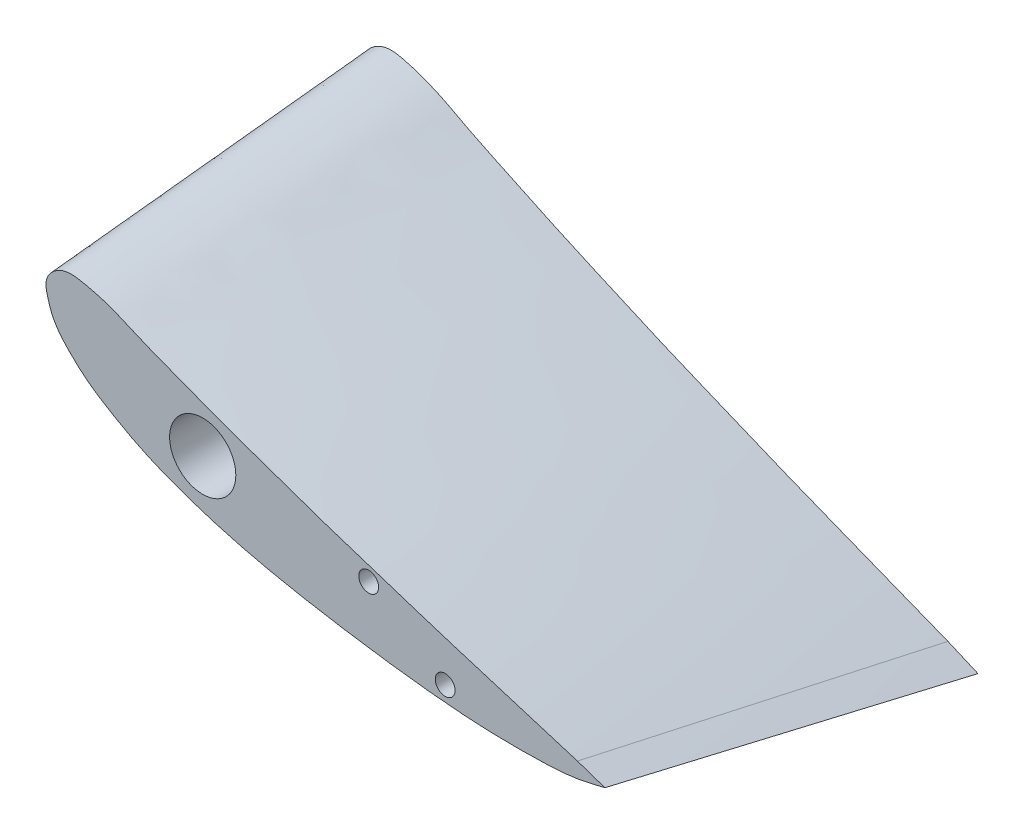
ISO-10303-21;
HEADER;
FILE_DESCRIPTION(('STEP AP214'),'2;1');
FILE_NAME('part.step','',(''),(''),'','','');
FILE_SCHEMA(('AUTOMOTIVE_DESIGN { 1 0 10303 214 1 1 1 1 }'));
ENDSEC;
DATA;
#1=APPLICATION_CONTEXT('core data for automotive mechanical design processes');
#2=APPLICATION_PROTOCOL_DEFINITION('international standard','automotive_design',2000,#1);
#3=PRODUCT_CONTEXT('',#1,'mechanical');
#4=PRODUCT('Part','Part','',(#3));
#5=PRODUCT_RELATED_PRODUCT_CATEGORY('part','',(#4));
#6=PRODUCT_DEFINITION_FORMATION('','',#4);
#7=PRODUCT_DEFINITION_CONTEXT('part definition',#1,'design');
#8=PRODUCT_DEFINITION('design','',#6,#7);
#9=PRODUCT_DEFINITION_SHAPE('','',#8);
#10=(LENGTH_UNIT() NAMED_UNIT(*) SI_UNIT(.MILLI.,.METRE.));
#11=(NAMED_UNIT(*) PLANE_ANGLE_UNIT() SI_UNIT($,.RADIAN.));
#12=(NAMED_UNIT(*) SI_UNIT($,.STERADIAN.) SOLID_ANGLE_UNIT());
#13=UNCERTAINTY_MEASURE_WITH_UNIT(LENGTH_MEASURE(1.E-05),#10,'distance_accuracy_value','');
#14=(GEOMETRIC_REPRESENTATION_CONTEXT(3) GLOBAL_UNCERTAINTY_ASSIGNED_CONTEXT((#13)) GLOBAL_UNIT_ASSIGNED_CONTEXT((#10,
#11,#12)) REPRESENTATION_CONTEXT('',''));
#15=CARTESIAN_POINT('',(0.,0.,0.));
#16=DIRECTION('',(0.,0.,1.));
#17=DIRECTION('',(1.,0.,0.));
#18=AXIS2_PLACEMENT_3D('',#15,#16,#17);
#19=CARTESIAN_POINT('',(-25.0498265206238,10.3590252410629,-50.));
#20=DIRECTION('',(0.,0.,1.));
#21=DIRECTION('',(1.,0.,0.));
#22=AXIS2_PLACEMENT_3D('',#19,#20,#21);
#23=PLANE('',#22);
#24=CARTESIAN_POINT('',(36.622171624693,-11.6170764544321,-50.));
#25=DIRECTION('',(0.,0.,1.));
#26=DIRECTION('',(1.,0.,0.));
#27=AXIS2_PLACEMENT_3D('',#24,#25,#26);
#28=CIRCLE('',#27,1.5);
#29=CARTESIAN_POINT('',(38.122171624693,-11.6170764544321,-50.));
#30=VERTEX_POINT('',#29);
#31=EDGE_CURVE('E86',#30,#30,#28,.T.);
#32=ORIENTED_EDGE('',*,*,#31,.T.);
#33=EDGE_LOOP('',(#32));
#34=FACE_BOUND('',#33,.T.);
#35=CARTESIAN_POINT('',(0.,0.,-50.));
#36=DIRECTION('',(0.,0.,1.));
#37=DIRECTION('',(1.,0.,0.));
#38=AXIS2_PLACEMENT_3D('',#35,#36,#37);
#39=CIRCLE('',#38,5.);
#40=CARTESIAN_POINT('',(5.,0.,-50.));
#41=VERTEX_POINT('',#40);
#42=EDGE_CURVE('E66',#41,#41,#39,.T.);
#43=ORIENTED_EDGE('',*,*,#42,.T.);
#44=EDGE_LOOP('',(#43));
#45=FACE_BOUND('',#44,.T.);
#46=CARTESIAN_POINT('',(62.5682376225377,-17.9494229542019,-50.));
#47=CARTESIAN_POINT('',(61.0357457282401,-17.3455695900279,-50.));
#48=CARTESIAN_POINT('',(56.4382700453486,-15.5340094975074,-50.));
#49=CARTESIAN_POINT('',(48.781755680583,-12.5000503526215,-50.));
#50=CARTESIAN_POINT('',(39.5664322748496,-8.93022166843071,-50.));
#51=CARTESIAN_POINT('',(30.4567321540915,-5.10230838615116,-50.));
#52=CARTESIAN_POINT('',(21.2890860327248,-1.41760363622451,-50.));
#53=CARTESIAN_POINT('',(12.2537365587949,2.57937965401302,-50.));
#54=CARTESIAN_POINT('',(3.21095936745961,6.5641300105625,-50.));
#55=CARTESIAN_POINT('',(-4.21736498331717,10.1219086891791,-50.));
#56=CARTESIAN_POINT('',(-10.1774723136762,12.9464593951471,-50.));
#57=CARTESIAN_POINT('',(-13.7648359699021,14.9884174682574,-50.));
#58=CARTESIAN_POINT('',(-16.8358573857455,16.2288422339769,-50.));
#59=CARTESIAN_POINT('',(-19.2080375673609,16.9777128391934,-50.));
#60=CARTESIAN_POINT('',(-21.3952292871398,17.4877016099179,-50.));
#61=CARTESIAN_POINT('',(-23.771560650514,16.9689972608538,-50.));
#62=CARTESIAN_POINT('',(-26.0433252267511,15.0075642123905,-50.));
#63=CARTESIAN_POINT('',(-25.5032404090968,12.1047307293946,-50.));
#64=CARTESIAN_POINT('',(-24.8803183236597,9.51973752205132,-50.));
#65=CARTESIAN_POINT('',(-23.5261895675087,7.21966070796016,-50.));
#66=CARTESIAN_POINT('',(-21.6743094600578,5.04276467310707,-50.));
#67=CARTESIAN_POINT('',(-19.2500879985792,2.47005140726315,-50.));
#68=CARTESIAN_POINT('',(-15.8071546912047,-0.0870152275616799,-50.));
#69=CARTESIAN_POINT('',(-10.2643938601049,-3.81195920309618,-50.));
#70=CARTESIAN_POINT('',(-2.78389204739485,-7.41729783616147,-50.));
#71=CARTESIAN_POINT('',(6.50179465100997,-10.898120976513,-50.));
#72=CARTESIAN_POINT('',(16.0743983631768,-13.6416938121953,-50.));
#73=CARTESIAN_POINT('',(25.798496222536,-16.0285276306475,-50.));
#74=CARTESIAN_POINT('',(35.6670590562567,-18.1328429202074,-50.));
#75=CARTESIAN_POINT('',(45.7550188838285,-19.8346426859498,-50.));
#76=CARTESIAN_POINT('',(54.3714145651777,-20.558824847849,-50.));
#77=CARTESIAN_POINT('',(61.5564708345186,-20.7985556166248,-50.));
#78=CARTESIAN_POINT('',(65.2154740512997,-20.2045881455057,-50.));
#79=CARTESIAN_POINT('',(67.1071252238897,-19.8975156460695,-50.));
#80=B_SPLINE_CURVE_WITH_KNOTS('',3,(#46,#47,#48,#49,#50,#51,#52,#53,#54,#55,#56,#57,#58,#59,#60,
#61,#62,#63,#64,#65,#66,#67,#68,#69,#70,#71,#72,#73,#74,#75,#76,#77,#78,#79),.UNSPECIFIED.,.F.,
.F.,(4,1,1,1,1,1,1,1,1,1,1,1,1,1,1,1,1,1,1,1,1,1,1,1,1,1,1,1,1,1,1,4),(0.,0.024539223239315,
0.0736176697179449,0.122696116196575,0.171758102468826,0.220820088741077,0.269879113320182,
0.318936693489756,0.368025361597795,0.392583028094628,0.417173001250673,0.429440472758663,
0.441764658743505,0.454461371263475,0.461994015532278,0.477712656864197,0.492780517083889,
0.502278122505289,0.517831839222446,0.531656069899839,0.544957030128068,0.57036121074101,
0.595284183630096,0.644429948946362,0.693535769444944,0.742943262592495,0.792666042354747,
0.842690657547491,0.893260265870848,0.94491578158227,0.971522264346957,1.),.UNSPECIFIED.);
#81=CARTESIAN_POINT('',(62.5682376225377,-17.9494229542019,-50.));
#82=VERTEX_POINT('',#81);
#83=CARTESIAN_POINT('',(67.1071252238897,-19.8975156460695,-50.));
#84=VERTEX_POINT('',#83);
#85=EDGE_CURVE('E63',#82,#84,#80,.T.);
#86=ORIENTED_EDGE('',*,*,#85,.F.);
#87=DIRECTION('',(-0.918935606831705,0.394407594370147,0.));
#88=VECTOR('',#87,1.);
#89=CARTESIAN_POINT('',(62.5682376225377,-17.9494229542019,-50.));
#90=LINE('',#89,#88);
#91=EDGE_CURVE('E37',#84,#82,#90,.T.);
#92=ORIENTED_EDGE('',*,*,#91,.F.);
#93=EDGE_LOOP('',(#86,#92));
#94=FACE_BOUND('',#93,.T.);
#95=ADVANCED_FACE('F34',(#34,#45,#94),#23,.F.);
#96=CARTESIAN_POINT('',(-22.8791566427922,7.44781594855477,0.));
#97=DIRECTION('',(0.,0.,1.));
#98=DIRECTION('',(1.,0.,0.));
#99=AXIS2_PLACEMENT_3D('',#96,#97,#98);
#100=PLANE('',#99);
#101=CARTESIAN_POINT('',(25.0709543311335,-3.88232454138966,0.));
#102=DIRECTION('',(0.,0.,1.));
#103=DIRECTION('',(1.,0.,0.));
#104=AXIS2_PLACEMENT_3D('',#101,#102,#103);
#105=CIRCLE('',#104,1.5);
#106=CARTESIAN_POINT('',(26.5709543311335,-3.88232454138966,0.));
#107=VERTEX_POINT('',#106);
#108=EDGE_CURVE('E95',#107,#107,#105,.T.);
#109=ORIENTED_EDGE('',*,*,#108,.F.);
#110=EDGE_LOOP('',(#109));
#111=FACE_BOUND('',#110,.T.);
#112=CARTESIAN_POINT('',(36.622171624693,-11.6170764544321,0.));
#113=DIRECTION('',(0.,0.,1.));
#114=DIRECTION('',(1.,0.,0.));
#115=AXIS2_PLACEMENT_3D('',#112,#113,#114);
#116=CIRCLE('',#115,1.5);
#117=CARTESIAN_POINT('',(38.122171624693,-11.6170764544321,0.));
#118=VERTEX_POINT('',#117);
#119=EDGE_CURVE('E89',#118,#118,#116,.T.);
#120=ORIENTED_EDGE('',*,*,#119,.F.);
#121=EDGE_LOOP('',(#120));
#122=FACE_BOUND('',#121,.T.);
#123=CARTESIAN_POINT('',(0.,0.,0.));
#124=DIRECTION('',(0.,0.,1.));
#125=DIRECTION('',(1.,0.,0.));
#126=AXIS2_PLACEMENT_3D('',#123,#124,#125);
#127=CIRCLE('',#126,5.);
#128=CARTESIAN_POINT('',(5.,0.,0.));
#129=VERTEX_POINT('',#128);
#130=EDGE_CURVE('E80',#129,#129,#127,.T.);
#131=ORIENTED_EDGE('',*,*,#130,.F.);
#132=EDGE_LOOP('',(#131));
#133=FACE_BOUND('',#132,.T.);
#134=CARTESIAN_POINT('',(56.6024570185074,-11.5896250219396,0.));
#135=CARTESIAN_POINT('',(55.2048134510122,-11.1604344935175,0.));
#136=CARTESIAN_POINT('',(51.0118827485278,-9.87286290825259,0.));
#137=CARTESIAN_POINT('',(44.0279175606617,-7.71350006442647,0.));
#138=CARTESIAN_POINT('',(35.6276858278107,-5.18691611165618,0.));
#139=CARTESIAN_POINT('',(27.3032106553515,-2.42468744187908,0.));
#140=CARTESIAN_POINT('',(18.9372859201274,0.206829889001657,0.));
#141=CARTESIAN_POINT('',(10.6670025413464,3.12378232174524,0.));
#142=CARTESIAN_POINT('',(2.39098564219053,6.02939924220704,0.));
#143=CARTESIAN_POINT('',(-4.42699730849515,8.66798481093618,0.));
#144=CARTESIAN_POINT('',(-9.89533665558932,10.7584765391876,0.));
#145=CARTESIAN_POINT('',(-13.2101744749283,12.3192783347707,0.));
#146=CARTESIAN_POINT('',(-16.0130505366379,13.2061990844741,0.));
#147=CARTESIAN_POINT('',(-18.1637386075881,13.7060850713725,0.));
#148=CARTESIAN_POINT('',(-20.1343217783409,14.0072685357314,0.));
#149=CARTESIAN_POINT('',(-22.2016730413183,13.3851171873459,0.));
#150=CARTESIAN_POINT('',(-24.0774533883304,11.4933873008038,0.));
#151=CARTESIAN_POINT('',(-23.4002403885398,8.96157065658385,0.));
#152=CARTESIAN_POINT('',(-22.6715373512482,6.71671597283292,0.));
#153=CARTESIAN_POINT('',(-21.3153036700787,4.7741931180889,0.));
#154=CARTESIAN_POINT('',(-19.527035772496,2.97484751217062,0.));
#155=CARTESIAN_POINT('',(-17.2050988353966,0.864507080193705,0.));
#156=CARTESIAN_POINT('',(-13.9827172985531,-1.16205904992076,0.));
#157=CARTESIAN_POINT('',(-8.82190676397202,-4.07801028604748,0.));
#158=CARTESIAN_POINT('',(-1.95448420856356,-6.75510285468226,0.));
#159=CARTESIAN_POINT('',(6.50190655456598,-9.19809055034063,0.));
#160=CARTESIAN_POINT('',(15.1615999891373,-10.9689467410081,0.));
#161=CARTESIAN_POINT('',(23.9308718776157,-12.4137043340175,0.));
#162=CARTESIAN_POINT('',(32.8085964211833,-13.5985279541091,0.));
#163=CARTESIAN_POINT('',(41.8528484347002,-14.4120815557239,0.));
#164=CARTESIAN_POINT('',(49.5277190812126,-14.461496170333,0.));
#165=CARTESIAN_POINT('',(55.9026581379685,-14.1804427216733,0.));
#166=CARTESIAN_POINT('',(59.0999556251021,-13.4036398299236,0.));
#167=CARTESIAN_POINT('',(60.7529116850797,-13.0020440908682,0.));
#168=B_SPLINE_CURVE_WITH_KNOTS('',3,(#134,#135,#136,#137,#138,#139,#140,#141,#142,#143,#144,
#145,#146,#147,#148,#149,#150,#151,#152,#153,#154,#155,#156,#157,#158,#159,#160,#161,#162,#163,
#164,#165,#166,#167),.UNSPECIFIED.,.F.,.F.,(4,1,1,1,1,1,1,1,1,1,1,1,1,1,1,1,1,1,1,1,1,1,1,1,1,1,
1,1,1,1,1,4),(0.,0.024539223239315,0.0736176697179449,0.122696116196575,0.171758102468826,
0.220820088741077,0.269879113320182,0.318936693489756,0.368025361597795,0.392583028094628,
0.417173001250673,0.429440472758663,0.441764658743505,0.454461371263475,0.461994015532278,
0.477712656864197,0.492780517083889,0.502278122505289,0.517831839222446,0.531656069899839,
0.544957030128068,0.57036121074101,0.595284183630096,0.644429948946362,0.693535769444944,
0.742943262592495,0.792666042354747,0.842690657547491,0.893260265870848,0.94491578158227,
0.971522264346957,1.),.UNSPECIFIED.);
#169=CARTESIAN_POINT('',(56.6024570185074,-11.5896250219396,0.));
#170=VERTEX_POINT('',#169);
#171=CARTESIAN_POINT('',(60.7529116850797,-13.0020440908682,0.));
#172=VERTEX_POINT('',#171);
#173=EDGE_CURVE('E43',#170,#172,#168,.T.);
#174=ORIENTED_EDGE('',*,*,#173,.T.);
#175=DIRECTION('',(-0.946684808707422,0.322161253043554,0.));
#176=VECTOR('',#175,1.);
#177=CARTESIAN_POINT('',(56.6024570185074,-11.5896250219396,0.));
#178=LINE('',#177,#176);
#179=EDGE_CURVE('E11',#172,#170,#178,.T.);
#180=ORIENTED_EDGE('',*,*,#179,.T.);
#181=EDGE_LOOP('',(#174,#180));
#182=FACE_BOUND('',#181,.T.);
#183=ADVANCED_FACE('F110',(#111,#122,#133,#182),#100,.T.);
#184=CARTESIAN_POINT('',(60.7529116850797,-13.0020440908682,0.));
#185=CARTESIAN_POINT('',(67.1071252238897,-19.8975156460695,-50.));
#186=CARTESIAN_POINT('',(59.0999556251021,-13.4036398299236,0.));
#187=CARTESIAN_POINT('',(65.2154740512997,-20.2045881455057,-50.));
#188=CARTESIAN_POINT('',(55.9026581379685,-14.1804427216733,0.));
#189=CARTESIAN_POINT('',(61.5564708345186,-20.7985556166248,-50.));
#190=CARTESIAN_POINT('',(49.5277190812126,-14.461496170333,0.));
#191=CARTESIAN_POINT('',(54.3714145651777,-20.558824847849,-50.));
#192=CARTESIAN_POINT('',(41.8528484347002,-14.4120815557239,0.));
#193=CARTESIAN_POINT('',(45.7550188838285,-19.8346426859498,-50.));
#194=CARTESIAN_POINT('',(32.8085964211833,-13.5985279541091,0.));
#195=CARTESIAN_POINT('',(35.6670590562567,-18.1328429202074,-50.));
#196=CARTESIAN_POINT('',(23.9308718776157,-12.4137043340175,0.));
#197=CARTESIAN_POINT('',(25.798496222536,-16.0285276306475,-50.));
#198=CARTESIAN_POINT('',(15.1615999891373,-10.9689467410081,0.));
#199=CARTESIAN_POINT('',(16.0743983631768,-13.6416938121953,-50.));
#200=CARTESIAN_POINT('',(6.50190655456598,-9.19809055034063,0.));
#201=CARTESIAN_POINT('',(6.50179465100997,-10.898120976513,-50.));
#202=CARTESIAN_POINT('',(-1.95448420856356,-6.75510285468226,0.));
#203=CARTESIAN_POINT('',(-2.78389204739485,-7.41729783616147,-50.));
#204=CARTESIAN_POINT('',(-8.82190676397202,-4.07801028604748,0.));
#205=CARTESIAN_POINT('',(-10.2643938601049,-3.81195920309618,-50.));
#206=CARTESIAN_POINT('',(-13.9827172985531,-1.16205904992076,0.));
#207=CARTESIAN_POINT('',(-15.8071546912047,-0.0870152275616799,-50.));
#208=CARTESIAN_POINT('',(-17.2050988353966,0.864507080193705,0.));
#209=CARTESIAN_POINT('',(-19.2500879985792,2.47005140726315,-50.));
#210=CARTESIAN_POINT('',(-19.527035772496,2.97484751217062,0.));
#211=CARTESIAN_POINT('',(-21.6743094600578,5.04276467310707,-50.));
#212=CARTESIAN_POINT('',(-21.3153036700787,4.7741931180889,0.));
#213=CARTESIAN_POINT('',(-23.5261895675087,7.21966070796016,-50.));
#214=CARTESIAN_POINT('',(-22.6715373512482,6.71671597283292,0.));
#215=CARTESIAN_POINT('',(-24.8803183236597,9.51973752205132,-50.));
#216=CARTESIAN_POINT('',(-23.4002403885398,8.96157065658385,0.));
#217=CARTESIAN_POINT('',(-25.5032404090968,12.1047307293946,-50.));
#218=CARTESIAN_POINT('',(-24.0774533883304,11.4933873008038,0.));
#219=CARTESIAN_POINT('',(-26.0433252267511,15.0075642123905,-50.));
#220=CARTESIAN_POINT('',(-22.2016730413183,13.3851171873459,0.));
#221=CARTESIAN_POINT('',(-23.771560650514,16.9689972608538,-50.));
#222=CARTESIAN_POINT('',(-20.1343217783409,14.0072685357314,0.));
#223=CARTESIAN_POINT('',(-21.3952292871398,17.4877016099179,-50.));
#224=CARTESIAN_POINT('',(-18.1637386075881,13.7060850713725,0.));
#225=CARTESIAN_POINT('',(-19.2080375673609,16.9777128391934,-50.));
#226=CARTESIAN_POINT('',(-16.0130505366379,13.2061990844741,0.));
#227=CARTESIAN_POINT('',(-16.8358573857455,16.2288422339769,-50.));
#228=CARTESIAN_POINT('',(-13.2101744749283,12.3192783347707,0.));
#229=CARTESIAN_POINT('',(-13.7648359699021,14.9884174682574,-50.));
#230=CARTESIAN_POINT('',(-9.89533665558932,10.7584765391876,0.));
#231=CARTESIAN_POINT('',(-10.1774723136762,12.9464593951471,-50.));
#232=CARTESIAN_POINT('',(-4.42699730849515,8.66798481093618,0.));
#233=CARTESIAN_POINT('',(-4.21736498331717,10.1219086891791,-50.));
#234=CARTESIAN_POINT('',(2.39098564219053,6.02939924220704,0.));
#235=CARTESIAN_POINT('',(3.21095936745961,6.5641300105625,-50.));
#236=CARTESIAN_POINT('',(10.6670025413464,3.12378232174524,0.));
#237=CARTESIAN_POINT('',(12.2537365587949,2.57937965401302,-50.));
#238=CARTESIAN_POINT('',(18.9372859201274,0.206829889001657,0.));
#239=CARTESIAN_POINT('',(21.2890860327248,-1.41760363622451,-50.));
#240=CARTESIAN_POINT('',(27.3032106553515,-2.42468744187908,0.));
#241=CARTESIAN_POINT('',(30.4567321540915,-5.10230838615116,-50.));
#242=CARTESIAN_POINT('',(35.6276858278107,-5.18691611165618,0.));
#243=CARTESIAN_POINT('',(39.5664322748496,-8.93022166843071,-50.));
#244=CARTESIAN_POINT('',(44.0279175606617,-7.71350006442647,0.));
#245=CARTESIAN_POINT('',(48.781755680583,-12.5000503526215,-50.));
#246=CARTESIAN_POINT('',(51.0118827485278,-9.87286290825259,0.));
#247=CARTESIAN_POINT('',(56.4382700453486,-15.5340094975074,-50.));
#248=CARTESIAN_POINT('',(55.2048134510122,-11.1604344935175,0.));
#249=CARTESIAN_POINT('',(61.0357457282401,-17.3455695900279,-50.));
#250=CARTESIAN_POINT('',(56.6024570185074,-11.5896250219396,0.));
#251=CARTESIAN_POINT('',(62.5682376225377,-17.9494229542019,-50.));
#252=B_SPLINE_SURFACE_WITH_KNOTS('',3,1,((#184,#185),(#186,#187),(#188,#189),(#190,#191),(#192,
#193),(#194,#195),(#196,#197),(#198,#199),(#200,#201),(#202,#203),(#204,#205),(#206,#207),(#208,
#209),(#210,#211),(#212,#213),(#214,#215),(#216,#217),(#218,#219),(#220,#221),(#222,#223),(#224,
#225),(#226,#227),(#228,#229),(#230,#231),(#232,#233),(#234,#235),(#236,#237),(#238,#239),(#240,
#241),(#242,#243),(#244,#245),(#246,#247),(#248,#249),(#250,#251)),.UNSPECIFIED.,.F.,.F.,.F.,(4,
1,1,1,1,1,1,1,1,1,1,1,1,1,1,1,1,1,1,1,1,1,1,1,1,1,1,1,1,1,1,4),(2,2),(0.,0.0284777356530428,
0.05508421841773,0.106739734129152,0.157309342452509,0.207333957645253,0.257056737407505,
0.306464230555056,0.355570051053638,0.404715816369904,0.42963878925899,0.455042969871932,
0.468343930100161,0.482168160777554,0.497721877494711,0.507219482916111,0.522287343135803,
0.538005984467722,0.545538628736525,0.558235341256495,0.570559527241337,0.582826998749327,
0.607416971905372,0.631974638402205,0.681063306510244,0.730120886679818,0.779179911258923,
0.828241897531174,0.877303883803425,0.926382330282055,0.975460776760685,1.),(0.,1.),.UNSPECIFIED.);
#253=DIRECTION('',(0.117541487284788,-0.125304659592042,-0.985130824333196));
#254=VECTOR('',#253,1.);
#255=CARTESIAN_POINT('',(59.5853473205226,-14.7695239880708,-25.));
#256=LINE('',#255,#254);
#257=EDGE_CURVE('E58',#170,#82,#256,.T.);
#258=DIRECTION('',(-0.124906800383364,0.135546481690317,0.982865933136034));
#259=VECTOR('',#258,1.);
#260=CARTESIAN_POINT('',(63.9300184544847,-16.4497798684688,-25.));
#261=LINE('',#260,#259);
#262=EDGE_CURVE('E52',#84,#172,#261,.T.);
#263=ORIENTED_EDGE('',*,*,#173,.F.);
#264=ORIENTED_EDGE('',*,*,#257,.T.);
#265=ORIENTED_EDGE('',*,*,#85,.T.);
#266=ORIENTED_EDGE('',*,*,#262,.T.);
#267=EDGE_LOOP('',(#263,#264,#265,#266));
#268=FACE_BOUND('',#267,.T.);
#269=ADVANCED_FACE('F65',(#268),#252,.T.);
#270=CARTESIAN_POINT('',(56.6024570185074,-11.5896250219396,0.));
#271=CARTESIAN_POINT('',(62.5682376225377,-17.9494229542019,-50.));
#272=CARTESIAN_POINT('',(57.2941994629361,-11.8250282000944,0.));
#273=CARTESIAN_POINT('',(63.3247188894298,-18.2741050695132,-50.));
#274=CARTESIAN_POINT('',(57.9859419073648,-12.0604313782492,0.));
#275=CARTESIAN_POINT('',(64.0812001563218,-18.5987871848245,-50.));
#276=CARTESIAN_POINT('',(59.3694267962222,-12.5312377345587,0.));
#277=CARTESIAN_POINT('',(65.5941626901058,-19.248151415447,-50.));
#278=CARTESIAN_POINT('',(60.0611692406509,-12.7666409127134,0.));
#279=CARTESIAN_POINT('',(66.3506439569978,-19.5728335307582,-50.));
#280=CARTESIAN_POINT('',(60.7529116850797,-13.0020440908682,0.));
#281=CARTESIAN_POINT('',(67.1071252238897,-19.8975156460695,-50.));
#282=B_SPLINE_SURFACE_WITH_KNOTS('',3,1,((#270,#271),(#272,#273),(#274,#275),(#276,#277),(#278,
#279),(#280,#281)),.UNSPECIFIED.,.F.,.F.,.F.,(4,2,4),(2,2),(0.,0.5,1.),(0.,1.),.UNSPECIFIED.);
#283=ORIENTED_EDGE('',*,*,#179,.F.);
#284=ORIENTED_EDGE('',*,*,#262,.F.);
#285=ORIENTED_EDGE('',*,*,#91,.T.);
#286=ORIENTED_EDGE('',*,*,#257,.F.);
#287=EDGE_LOOP('',(#283,#284,#285,#286));
#288=FACE_BOUND('',#287,.T.);
#289=ADVANCED_FACE('F67',(#288),#282,.T.);
#290=CARTESIAN_POINT('',(0.,0.,-50.));
#291=DIRECTION('',(0.,0.,1.));
#292=DIRECTION('',(1.,0.,0.));
#293=AXIS2_PLACEMENT_3D('',#290,#291,#292);
#294=CYLINDRICAL_SURFACE('',#293,5.);
#295=ORIENTED_EDGE('',*,*,#42,.F.);
#296=EDGE_LOOP('',(#295));
#297=FACE_BOUND('',#296,.T.);
#298=ORIENTED_EDGE('',*,*,#130,.T.);
#299=EDGE_LOOP('',(#298));
#300=FACE_BOUND('',#299,.T.);
#301=ADVANCED_FACE('F119',(#297,#300),#294,.F.);
#302=CARTESIAN_POINT('',(36.622171624693,-11.6170764544321,-50.));
#303=DIRECTION('',(0.,0.,1.));
#304=DIRECTION('',(1.,0.,0.));
#305=AXIS2_PLACEMENT_3D('',#302,#303,#304);
#306=CYLINDRICAL_SURFACE('',#305,1.5);
#307=ORIENTED_EDGE('',*,*,#31,.F.);
#308=EDGE_LOOP('',(#307));
#309=FACE_BOUND('',#308,.T.);
#310=ORIENTED_EDGE('',*,*,#119,.T.);
#311=EDGE_LOOP('',(#310));
#312=FACE_BOUND('',#311,.T.);
#313=ADVANCED_FACE('F106',(#309,#312),#306,.F.);
#314=CARTESIAN_POINT('',(25.0709543311335,-3.88232454138966,-10.));
#315=DIRECTION('',(0.,0.,1.));
#316=DIRECTION('',(1.,0.,0.));
#317=AXIS2_PLACEMENT_3D('',#314,#315,#316);
#318=CYLINDRICAL_SURFACE('',#317,1.5);
#319=CARTESIAN_POINT('',(25.0709543311335,-3.88232454138966,-10.));
#320=DIRECTION('',(0.,0.,1.));
#321=DIRECTION('',(1.,0.,0.));
#322=AXIS2_PLACEMENT_3D('',#319,#320,#321);
#323=CIRCLE('',#322,1.5);
#324=CARTESIAN_POINT('',(26.5709543311335,-3.88232454138966,-10.));
#325=VERTEX_POINT('',#324);
#326=EDGE_CURVE('E92',#325,#325,#323,.T.);
#327=ORIENTED_EDGE('',*,*,#326,.F.);
#328=EDGE_LOOP('',(#327));
#329=FACE_BOUND('',#328,.T.);
#330=ORIENTED_EDGE('',*,*,#108,.T.);
#331=EDGE_LOOP('',(#330));
#332=FACE_BOUND('',#331,.T.);
#333=ADVANCED_FACE('F103',(#329,#332),#318,.F.);
#334=CARTESIAN_POINT('',(25.0709543311335,-3.88232454138966,-10.));
#335=DIRECTION('',(0.,0.,1.));
#336=DIRECTION('',(1.,0.,0.));
#337=AXIS2_PLACEMENT_3D('',#334,#335,#336);
#338=PLANE('',#337);
#339=ORIENTED_EDGE('',*,*,#326,.T.);
#340=EDGE_LOOP('',(#339));
#341=FACE_BOUND('',#340,.T.);
#342=ADVANCED_FACE('F101',(#341),#338,.T.);
#343=CLOSED_SHELL('',(#95,#183,#269,#289,#301,#313,#333,#342));
#344=MANIFOLD_SOLID_BREP('B2',#343);
#345=ADVANCED_BREP_SHAPE_REPRESENTATION('',(#18,#344),#14);
#346=SHAPE_DEFINITION_REPRESENTATION(#9,#345);
ENDSEC;
END-ISO-10303-21;
